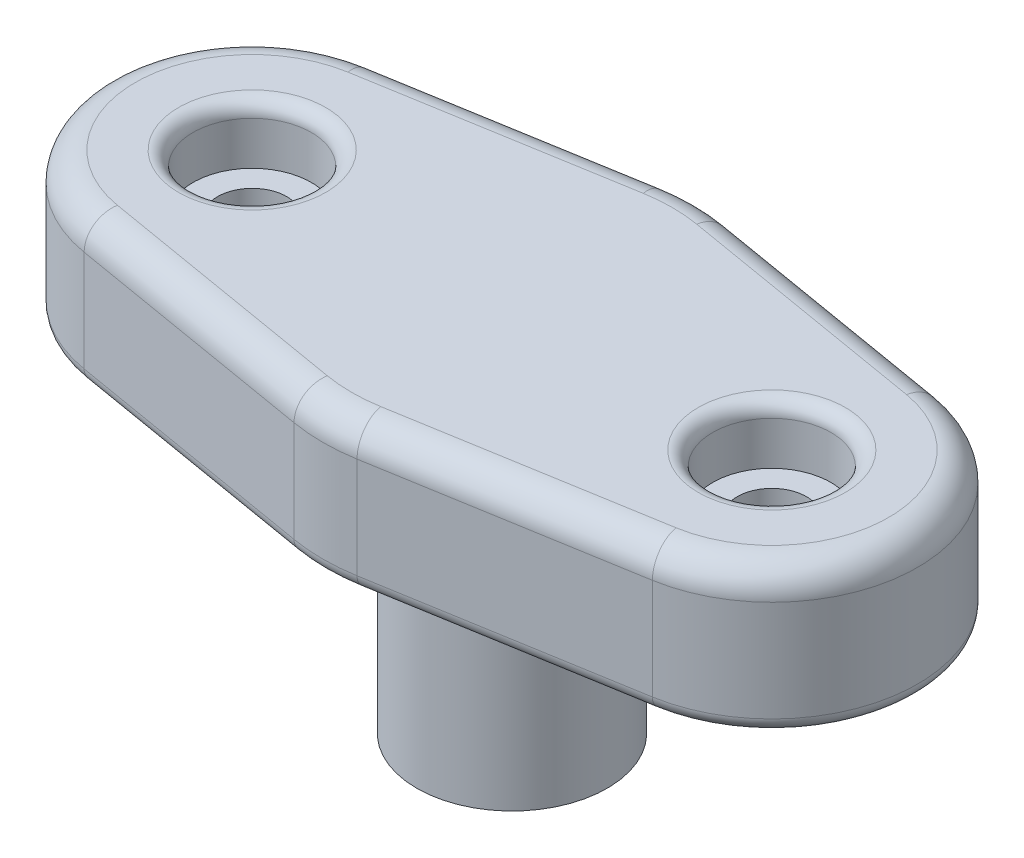
ISO-10303-21;
HEADER;
FILE_DESCRIPTION(('STEP AP214'),'2;1');
FILE_NAME('part.step','',(''),(''),'','','');
FILE_SCHEMA(('AUTOMOTIVE_DESIGN { 1 0 10303 214 1 1 1 1 }'));
ENDSEC;
DATA;
#1=APPLICATION_CONTEXT('core data for automotive mechanical design processes');
#2=APPLICATION_PROTOCOL_DEFINITION('international standard','automotive_design',2000,#1);
#3=PRODUCT_CONTEXT('',#1,'mechanical');
#4=PRODUCT('Part','Part','',(#3));
#5=PRODUCT_RELATED_PRODUCT_CATEGORY('part','',(#4));
#6=PRODUCT_DEFINITION_FORMATION('','',#4);
#7=PRODUCT_DEFINITION_CONTEXT('part definition',#1,'design');
#8=PRODUCT_DEFINITION('design','',#6,#7);
#9=PRODUCT_DEFINITION_SHAPE('','',#8);
#10=(LENGTH_UNIT() NAMED_UNIT(*) SI_UNIT(.MILLI.,.METRE.));
#11=(NAMED_UNIT(*) PLANE_ANGLE_UNIT() SI_UNIT($,.RADIAN.));
#12=(NAMED_UNIT(*) SI_UNIT($,.STERADIAN.) SOLID_ANGLE_UNIT());
#13=UNCERTAINTY_MEASURE_WITH_UNIT(LENGTH_MEASURE(1.E-05),#10,'distance_accuracy_value','');
#14=(GEOMETRIC_REPRESENTATION_CONTEXT(3) GLOBAL_UNCERTAINTY_ASSIGNED_CONTEXT((#13)) GLOBAL_UNIT_ASSIGNED_CONTEXT((#10,
#11,#12)) REPRESENTATION_CONTEXT('',''));
#15=CARTESIAN_POINT('',(0.,0.,0.));
#16=DIRECTION('',(0.,0.,1.));
#17=DIRECTION('',(1.,0.,0.));
#18=AXIS2_PLACEMENT_3D('',#15,#16,#17);
#19=CARTESIAN_POINT('',(9.,13.,0.));
#20=DIRECTION('',(0.,-1.,0.));
#21=DIRECTION('',(0.,0.,-1.));
#22=AXIS2_PLACEMENT_3D('',#19,#20,#21);
#23=CYLINDRICAL_SURFACE('',#22,1.2);
#24=CARTESIAN_POINT('',(9.,8.,0.));
#25=DIRECTION('',(0.,1.,0.));
#26=DIRECTION('',(0.,0.,1.));
#27=AXIS2_PLACEMENT_3D('',#24,#25,#26);
#28=CIRCLE('',#27,1.2);
#29=CARTESIAN_POINT('',(9.,8.,1.2));
#30=VERTEX_POINT('',#29);
#31=EDGE_CURVE('E414',#30,#30,#28,.T.);
#32=ORIENTED_EDGE('',*,*,#31,.F.);
#33=EDGE_LOOP('',(#32));
#34=FACE_BOUND('',#33,.T.);
#35=CARTESIAN_POINT('',(9.,11.,0.));
#36=DIRECTION('',(0.,1.,0.));
#37=DIRECTION('',(0.,0.,1.));
#38=AXIS2_PLACEMENT_3D('',#35,#36,#37);
#39=CIRCLE('',#38,1.2);
#40=CARTESIAN_POINT('',(9.,11.,1.2));
#41=VERTEX_POINT('',#40);
#42=EDGE_CURVE('E208',#41,#41,#39,.T.);
#43=ORIENTED_EDGE('',*,*,#42,.T.);
#44=EDGE_LOOP('',(#43));
#45=FACE_BOUND('',#44,.T.);
#46=ADVANCED_FACE('F45',(#34,#45),#23,.F.);
#47=CARTESIAN_POINT('',(-9.,13.,0.));
#48=DIRECTION('',(0.,-1.,0.));
#49=DIRECTION('',(0.,0.,-1.));
#50=AXIS2_PLACEMENT_3D('',#47,#48,#49);
#51=CYLINDRICAL_SURFACE('',#50,1.2);
#52=CARTESIAN_POINT('',(-9.,8.,0.));
#53=DIRECTION('',(0.,1.,0.));
#54=DIRECTION('',(0.,0.,1.));
#55=AXIS2_PLACEMENT_3D('',#52,#53,#54);
#56=CIRCLE('',#55,1.2);
#57=CARTESIAN_POINT('',(-9.,8.,1.2));
#58=VERTEX_POINT('',#57);
#59=EDGE_CURVE('E402',#58,#58,#56,.T.);
#60=ORIENTED_EDGE('',*,*,#59,.F.);
#61=EDGE_LOOP('',(#60));
#62=FACE_BOUND('',#61,.T.);
#63=CARTESIAN_POINT('',(-9.,11.,0.));
#64=DIRECTION('',(0.,1.,0.));
#65=DIRECTION('',(0.,0.,1.));
#66=AXIS2_PLACEMENT_3D('',#63,#64,#65);
#67=CIRCLE('',#66,1.2);
#68=CARTESIAN_POINT('',(-9.,11.,1.2));
#69=VERTEX_POINT('',#68);
#70=EDGE_CURVE('E393',#69,#69,#67,.T.);
#71=ORIENTED_EDGE('',*,*,#70,.T.);
#72=EDGE_LOOP('',(#71));
#73=FACE_BOUND('',#72,.T.);
#74=ADVANCED_FACE('F490',(#62,#73),#51,.F.);
#75=CARTESIAN_POINT('',(0.,8.,0.));
#76=DIRECTION('',(0.,-1.,0.));
#77=DIRECTION('',(0.,0.,-1.));
#78=AXIS2_PLACEMENT_3D('',#75,#76,#77);
#79=CYLINDRICAL_SURFACE('',#78,3.3);
#80=CARTESIAN_POINT('',(0.,8.,0.));
#81=DIRECTION('',(0.,1.,0.));
#82=DIRECTION('',(0.,0.,1.));
#83=AXIS2_PLACEMENT_3D('',#80,#81,#82);
#84=CIRCLE('',#83,3.3);
#85=CARTESIAN_POINT('',(0.,8.,3.3));
#86=VERTEX_POINT('',#85);
#87=EDGE_CURVE('E199',#86,#86,#84,.T.);
#88=ORIENTED_EDGE('',*,*,#87,.F.);
#89=EDGE_LOOP('',(#88));
#90=FACE_BOUND('',#89,.T.);
#91=CARTESIAN_POINT('',(0.,0.,0.));
#92=DIRECTION('',(0.,1.,0.));
#93=DIRECTION('',(0.,0.,1.));
#94=AXIS2_PLACEMENT_3D('',#91,#92,#93);
#95=CIRCLE('',#94,3.3);
#96=CARTESIAN_POINT('',(0.,0.,3.3));
#97=VERTEX_POINT('',#96);
#98=EDGE_CURVE('E168',#97,#97,#95,.T.);
#99=ORIENTED_EDGE('',*,*,#98,.T.);
#100=EDGE_LOOP('',(#99));
#101=FACE_BOUND('',#100,.T.);
#102=ADVANCED_FACE('F497',(#90,#101),#79,.T.);
#103=CARTESIAN_POINT('',(0.,0.,0.));
#104=DIRECTION('',(0.,1.,0.));
#105=DIRECTION('',(0.,0.,1.));
#106=AXIS2_PLACEMENT_3D('',#103,#104,#105);
#107=PLANE('',#106);
#108=ORIENTED_EDGE('',*,*,#98,.F.);
#109=EDGE_LOOP('',(#108));
#110=FACE_BOUND('',#109,.T.);
#111=ADVANCED_FACE('F507',(#110),#107,.F.);
#112=CARTESIAN_POINT('',(-9.,13.,0.));
#113=DIRECTION('',(0.,1.,0.));
#114=DIRECTION('',(0.,0.,1.));
#115=AXIS2_PLACEMENT_3D('',#112,#113,#114);
#116=PLANE('',#115);
#117=CARTESIAN_POINT('',(0.,13.,0.));
#118=DIRECTION('',(0.,1.,0.));
#119=DIRECTION('',(0.,0.,1.));
#120=AXIS2_PLACEMENT_3D('',#117,#118,#119);
#121=CIRCLE('',#120,5.55);
#122=CARTESIAN_POINT('',(0.925000000000002,13.,-5.47237379936714));
#123=VERTEX_POINT('',#122);
#124=CARTESIAN_POINT('',(-0.924999999999999,13.,-5.47237379936714));
#125=VERTEX_POINT('',#124);
#126=EDGE_CURVE('E310',#123,#125,#121,.T.);
#127=ORIENTED_EDGE('',*,*,#126,.T.);
#128=DIRECTION('',(-0.986013297183269,0.,0.166666666666667));
#129=VECTOR('',#128,1.);
#130=CARTESIAN_POINT('',(-9.675,13.,-3.99335385359224));
#131=LINE('',#130,#129);
#132=CARTESIAN_POINT('',(-9.675,13.,-3.99335385359224));
#133=VERTEX_POINT('',#132);
#134=EDGE_CURVE('E313',#125,#133,#131,.T.);
#135=ORIENTED_EDGE('',*,*,#134,.T.);
#136=CARTESIAN_POINT('',(-9.,13.,0.));
#137=DIRECTION('',(0.,1.,0.));
#138=DIRECTION('',(0.,0.,1.));
#139=AXIS2_PLACEMENT_3D('',#136,#137,#138);
#140=CIRCLE('',#139,4.05);
#141=CARTESIAN_POINT('',(-9.675,13.,3.99335385359224));
#142=VERTEX_POINT('',#141);
#143=EDGE_CURVE('E266',#133,#142,#140,.T.);
#144=ORIENTED_EDGE('',*,*,#143,.T.);
#145=DIRECTION('',(0.986013297183269,0.,0.166666666666666));
#146=VECTOR('',#145,1.);
#147=CARTESIAN_POINT('',(-0.925,13.,5.47237379936715));
#148=LINE('',#147,#146);
#149=CARTESIAN_POINT('',(-0.925,13.,5.47237379936715));
#150=VERTEX_POINT('',#149);
#151=EDGE_CURVE('E295',#142,#150,#148,.T.);
#152=ORIENTED_EDGE('',*,*,#151,.T.);
#153=CARTESIAN_POINT('',(0.,13.,0.));
#154=DIRECTION('',(0.,1.,0.));
#155=DIRECTION('',(0.,0.,1.));
#156=AXIS2_PLACEMENT_3D('',#153,#154,#155);
#157=CIRCLE('',#156,5.55);
#158=CARTESIAN_POINT('',(0.925000000000002,13.,5.47237379936714));
#159=VERTEX_POINT('',#158);
#160=EDGE_CURVE('E298',#150,#159,#157,.T.);
#161=ORIENTED_EDGE('',*,*,#160,.T.);
#162=DIRECTION('',(0.986013297183269,0.,-0.166666666666667));
#163=VECTOR('',#162,1.);
#164=CARTESIAN_POINT('',(9.675,13.,3.99335385359224));
#165=LINE('',#164,#163);
#166=CARTESIAN_POINT('',(9.675,13.,3.99335385359224));
#167=VERTEX_POINT('',#166);
#168=EDGE_CURVE('E301',#159,#167,#165,.T.);
#169=ORIENTED_EDGE('',*,*,#168,.T.);
#170=CARTESIAN_POINT('',(9.,13.,0.));
#171=DIRECTION('',(0.,1.,0.));
#172=DIRECTION('',(0.,0.,1.));
#173=AXIS2_PLACEMENT_3D('',#170,#171,#172);
#174=CIRCLE('',#173,4.05);
#175=CARTESIAN_POINT('',(9.675,13.,-3.99335385359224));
#176=VERTEX_POINT('',#175);
#177=EDGE_CURVE('E304',#167,#176,#174,.T.);
#178=ORIENTED_EDGE('',*,*,#177,.T.);
#179=DIRECTION('',(-0.986013297183269,0.,-0.166666666666667));
#180=VECTOR('',#179,1.);
#181=CARTESIAN_POINT('',(0.925000000000004,13.,-5.47237379936714));
#182=LINE('',#181,#180);
#183=EDGE_CURVE('E307',#176,#123,#182,.T.);
#184=ORIENTED_EDGE('',*,*,#183,.T.);
#185=EDGE_LOOP('',(#127,#135,#144,#152,#161,#169,#178,#184));
#186=FACE_BOUND('',#185,.T.);
#187=CARTESIAN_POINT('',(9.,13.,0.));
#188=DIRECTION('',(0.,1.,0.));
#189=DIRECTION('',(0.,0.,1.));
#190=AXIS2_PLACEMENT_3D('',#187,#188,#189);
#191=CIRCLE('',#190,2.55);
#192=CARTESIAN_POINT('',(9.,13.,2.55));
#193=VERTEX_POINT('',#192);
#194=EDGE_CURVE('E259',#193,#193,#191,.F.);
#195=ORIENTED_EDGE('',*,*,#194,.T.);
#196=EDGE_LOOP('',(#195));
#197=FACE_BOUND('',#196,.T.);
#198=CARTESIAN_POINT('',(-9.,13.,0.));
#199=DIRECTION('',(0.,1.,0.));
#200=DIRECTION('',(0.,0.,1.));
#201=AXIS2_PLACEMENT_3D('',#198,#199,#200);
#202=CIRCLE('',#201,2.55);
#203=CARTESIAN_POINT('',(-9.,13.,2.55));
#204=VERTEX_POINT('',#203);
#205=EDGE_CURVE('E255',#204,#204,#202,.F.);
#206=ORIENTED_EDGE('',*,*,#205,.T.);
#207=EDGE_LOOP('',(#206));
#208=FACE_BOUND('',#207,.T.);
#209=ADVANCED_FACE('F464',(#186,#197,#208),#116,.T.);
#210=CARTESIAN_POINT('',(-9.,8.,0.));
#211=DIRECTION('',(0.,1.,0.));
#212=DIRECTION('',(0.,0.,1.));
#213=AXIS2_PLACEMENT_3D('',#210,#211,#212);
#214=PLANE('',#213);
#215=DIRECTION('',(0.986013297183269,0.,0.166666666666666));
#216=VECTOR('',#215,1.);
#217=CARTESIAN_POINT('',(-9.75833333333333,8.,4.48636050218388));
#218=LINE('',#217,#216);
#219=CARTESIAN_POINT('',(-1.00833333333333,8.,5.96538044795878));
#220=VERTEX_POINT('',#219);
#221=CARTESIAN_POINT('',(-9.75833333333333,8.,4.48636050218388));
#222=VERTEX_POINT('',#221);
#223=EDGE_CURVE('E198',#220,#222,#218,.F.);
#224=ORIENTED_EDGE('',*,*,#223,.T.);
#225=CARTESIAN_POINT('',(-9.,8.,0.));
#226=DIRECTION('',(0.,1.,0.));
#227=DIRECTION('',(0.,0.,1.));
#228=AXIS2_PLACEMENT_3D('',#225,#226,#227);
#229=CIRCLE('',#228,4.55);
#230=CARTESIAN_POINT('',(-9.75833333333333,8.,-4.48636050218387));
#231=VERTEX_POINT('',#230);
#232=EDGE_CURVE('E179',#222,#231,#229,.F.);
#233=ORIENTED_EDGE('',*,*,#232,.T.);
#234=DIRECTION('',(-0.986013297183269,0.,0.166666666666667));
#235=VECTOR('',#234,1.);
#236=CARTESIAN_POINT('',(-9.75833333333333,8.,-4.48636050218387));
#237=LINE('',#236,#235);
#238=CARTESIAN_POINT('',(-1.00833333333333,8.,-5.96538044795878));
#239=VERTEX_POINT('',#238);
#240=EDGE_CURVE('E225',#231,#239,#237,.F.);
#241=ORIENTED_EDGE('',*,*,#240,.T.);
#242=CARTESIAN_POINT('',(0.,8.,0.));
#243=DIRECTION('',(0.,1.,0.));
#244=DIRECTION('',(0.,0.,1.));
#245=AXIS2_PLACEMENT_3D('',#242,#243,#244);
#246=CIRCLE('',#245,6.05);
#247=CARTESIAN_POINT('',(1.00833333333334,8.,-5.96538044795878));
#248=VERTEX_POINT('',#247);
#249=EDGE_CURVE('E222',#239,#248,#246,.F.);
#250=ORIENTED_EDGE('',*,*,#249,.T.);
#251=DIRECTION('',(-0.986013297183269,0.,-0.166666666666667));
#252=VECTOR('',#251,1.);
#253=CARTESIAN_POINT('',(-7.74166666666666,8.,-7.44440039373368));
#254=LINE('',#253,#252);
#255=CARTESIAN_POINT('',(9.75833333333334,8.,-4.48636050218387));
#256=VERTEX_POINT('',#255);
#257=EDGE_CURVE('E219',#248,#256,#254,.F.);
#258=ORIENTED_EDGE('',*,*,#257,.T.);
#259=CARTESIAN_POINT('',(9.,8.,0.));
#260=DIRECTION('',(0.,1.,0.));
#261=DIRECTION('',(0.,0.,1.));
#262=AXIS2_PLACEMENT_3D('',#259,#260,#261);
#263=CIRCLE('',#262,4.55);
#264=CARTESIAN_POINT('',(9.75833333333333,8.,4.48636050218387));
#265=VERTEX_POINT('',#264);
#266=EDGE_CURVE('E216',#256,#265,#263,.F.);
#267=ORIENTED_EDGE('',*,*,#266,.T.);
#268=DIRECTION('',(0.986013297183269,0.,-0.166666666666667));
#269=VECTOR('',#268,1.);
#270=CARTESIAN_POINT('',(-7.74166666666666,8.,7.44440039373368));
#271=LINE('',#270,#269);
#272=CARTESIAN_POINT('',(1.00833333333334,8.,5.96538044795878));
#273=VERTEX_POINT('',#272);
#274=EDGE_CURVE('E213',#265,#273,#271,.F.);
#275=ORIENTED_EDGE('',*,*,#274,.T.);
#276=CARTESIAN_POINT('',(0.,8.,0.));
#277=DIRECTION('',(0.,1.,0.));
#278=DIRECTION('',(0.,0.,1.));
#279=AXIS2_PLACEMENT_3D('',#276,#277,#278);
#280=CIRCLE('',#279,6.05);
#281=EDGE_CURVE('E203',#273,#220,#280,.F.);
#282=ORIENTED_EDGE('',*,*,#281,.T.);
#283=EDGE_LOOP('',(#224,#233,#241,#250,#258,#267,#275,#282));
#284=FACE_BOUND('',#283,.T.);
#285=ORIENTED_EDGE('',*,*,#87,.T.);
#286=EDGE_LOOP('',(#285));
#287=FACE_BOUND('',#286,.T.);
#288=ORIENTED_EDGE('',*,*,#31,.T.);
#289=EDGE_LOOP('',(#288));
#290=FACE_BOUND('',#289,.T.);
#291=ORIENTED_EDGE('',*,*,#59,.T.);
#292=EDGE_LOOP('',(#291));
#293=FACE_BOUND('',#292,.T.);
#294=ADVANCED_FACE('F506',(#284,#287,#290,#293),#214,.F.);
#295=CARTESIAN_POINT('',(-9.,13.,0.));
#296=DIRECTION('',(0.,-1.,0.));
#297=DIRECTION('',(0.,0.,-1.));
#298=AXIS2_PLACEMENT_3D('',#295,#296,#297);
#299=CYLINDRICAL_SURFACE('',#298,5.05);
#300=DIRECTION('',(0.,-1.,0.));
#301=VECTOR('',#300,1.);
#302=CARTESIAN_POINT('',(-9.84166666666667,13.,4.97936715077551));
#303=LINE('',#302,#301);
#304=CARTESIAN_POINT('',(-9.84166666666667,12.,4.97936715077551));
#305=VERTEX_POINT('',#304);
#306=CARTESIAN_POINT('',(-9.84166666666667,8.5,4.97936715077551));
#307=VERTEX_POINT('',#306);
#308=EDGE_CURVE('E158',#305,#307,#303,.T.);
#309=ORIENTED_EDGE('',*,*,#308,.F.);
#310=CARTESIAN_POINT('',(-9.,12.,0.));
#311=DIRECTION('',(0.,1.,0.));
#312=DIRECTION('',(0.,0.,1.));
#313=AXIS2_PLACEMENT_3D('',#310,#311,#312);
#314=CIRCLE('',#313,5.05);
#315=CARTESIAN_POINT('',(-9.84166666666667,12.,-4.97936715077551));
#316=VERTEX_POINT('',#315);
#317=EDGE_CURVE('E11',#305,#316,#314,.F.);
#318=ORIENTED_EDGE('',*,*,#317,.T.);
#319=DIRECTION('',(0.,-1.,0.));
#320=VECTOR('',#319,1.);
#321=CARTESIAN_POINT('',(-9.84166666666667,13.,-4.97936715077551));
#322=LINE('',#321,#320);
#323=CARTESIAN_POINT('',(-9.84166666666667,8.5,-4.97936715077551));
#324=VERTEX_POINT('',#323);
#325=EDGE_CURVE('E195',#316,#324,#322,.T.);
#326=ORIENTED_EDGE('',*,*,#325,.T.);
#327=CARTESIAN_POINT('',(-9.,8.5,0.));
#328=DIRECTION('',(0.,1.,0.));
#329=DIRECTION('',(0.,0.,1.));
#330=AXIS2_PLACEMENT_3D('',#327,#328,#329);
#331=CIRCLE('',#330,5.05);
#332=EDGE_CURVE('E177',#324,#307,#331,.T.);
#333=ORIENTED_EDGE('',*,*,#332,.T.);
#334=EDGE_LOOP('',(#309,#318,#326,#333));
#335=FACE_BOUND('',#334,.T.);
#336=ADVANCED_FACE('F193',(#335),#299,.T.);
#337=CARTESIAN_POINT('',(-1.09166666666667,13.,6.45838709655041));
#338=DIRECTION('',(0.166666666666666,0.,-0.986013297183269));
#339=DIRECTION('',(-0.986013297183269,0.,-0.166666666666666));
#340=AXIS2_PLACEMENT_3D('',#337,#338,#339);
#341=PLANE('',#340);
#342=DIRECTION('',(0.,-1.,0.));
#343=VECTOR('',#342,1.);
#344=CARTESIAN_POINT('',(-1.09166666666667,13.,6.45838709655041));
#345=LINE('',#344,#343);
#346=CARTESIAN_POINT('',(-1.09166666666667,12.,6.45838709655041));
#347=VERTEX_POINT('',#346);
#348=CARTESIAN_POINT('',(-1.09166666666667,8.5,6.45838709655041));
#349=VERTEX_POINT('',#348);
#350=EDGE_CURVE('E169',#347,#349,#345,.T.);
#351=ORIENTED_EDGE('',*,*,#350,.F.);
#352=DIRECTION('',(0.986013297183269,0.,0.166666666666666));
#353=VECTOR('',#352,1.);
#354=CARTESIAN_POINT('',(-9.84166666666667,12.,4.97936715077551));
#355=LINE('',#354,#353);
#356=EDGE_CURVE('E55',#347,#305,#355,.F.);
#357=ORIENTED_EDGE('',*,*,#356,.T.);
#358=ORIENTED_EDGE('',*,*,#308,.T.);
#359=DIRECTION('',(0.986013297183269,0.,0.166666666666666));
#360=VECTOR('',#359,1.);
#361=CARTESIAN_POINT('',(-1.09166666666667,8.5,6.45838709655041));
#362=LINE('',#361,#360);
#363=EDGE_CURVE('E162',#307,#349,#362,.T.);
#364=ORIENTED_EDGE('',*,*,#363,.T.);
#365=EDGE_LOOP('',(#351,#357,#358,#364));
#366=FACE_BOUND('',#365,.T.);
#367=ADVANCED_FACE('F160',(#366),#341,.F.);
#368=CARTESIAN_POINT('',(0.,13.,0.));
#369=DIRECTION('',(0.,-1.,0.));
#370=DIRECTION('',(0.,0.,-1.));
#371=AXIS2_PLACEMENT_3D('',#368,#369,#370);
#372=CYLINDRICAL_SURFACE('',#371,6.55);
#373=DIRECTION('',(0.,-1.,0.));
#374=VECTOR('',#373,1.);
#375=CARTESIAN_POINT('',(1.09166666666667,13.,6.45838709655041));
#376=LINE('',#375,#374);
#377=CARTESIAN_POINT('',(1.09166666666667,12.,6.45838709655041));
#378=VERTEX_POINT('',#377);
#379=CARTESIAN_POINT('',(1.09166666666667,8.5,6.45838709655041));
#380=VERTEX_POINT('',#379);
#381=EDGE_CURVE('E378',#378,#380,#376,.T.);
#382=ORIENTED_EDGE('',*,*,#381,.F.);
#383=CARTESIAN_POINT('',(0.,12.,0.));
#384=DIRECTION('',(0.,1.,0.));
#385=DIRECTION('',(0.,0.,1.));
#386=AXIS2_PLACEMENT_3D('',#383,#384,#385);
#387=CIRCLE('',#386,6.55);
#388=EDGE_CURVE('E70',#378,#347,#387,.F.);
#389=ORIENTED_EDGE('',*,*,#388,.T.);
#390=ORIENTED_EDGE('',*,*,#350,.T.);
#391=CARTESIAN_POINT('',(0.,8.5,0.));
#392=DIRECTION('',(0.,1.,0.));
#393=DIRECTION('',(0.,0.,1.));
#394=AXIS2_PLACEMENT_3D('',#391,#392,#393);
#395=CIRCLE('',#394,6.55);
#396=EDGE_CURVE('E191',#349,#380,#395,.T.);
#397=ORIENTED_EDGE('',*,*,#396,.T.);
#398=EDGE_LOOP('',(#382,#389,#390,#397));
#399=FACE_BOUND('',#398,.T.);
#400=ADVANCED_FACE('F380',(#399),#372,.T.);
#401=CARTESIAN_POINT('',(9.84166666666667,13.,4.97936715077551));
#402=DIRECTION('',(-0.166666666666667,0.,-0.986013297183269));
#403=DIRECTION('',(-0.986013297183269,0.,0.166666666666667));
#404=AXIS2_PLACEMENT_3D('',#401,#402,#403);
#405=PLANE('',#404);
#406=DIRECTION('',(0.,-1.,0.));
#407=VECTOR('',#406,1.);
#408=CARTESIAN_POINT('',(9.84166666666667,13.,4.97936715077551));
#409=LINE('',#408,#407);
#410=CARTESIAN_POINT('',(9.84166666666667,12.,4.97936715077551));
#411=VERTEX_POINT('',#410);
#412=CARTESIAN_POINT('',(9.84166666666667,8.5,4.97936715077551));
#413=VERTEX_POINT('',#412);
#414=EDGE_CURVE('E379',#411,#413,#409,.T.);
#415=ORIENTED_EDGE('',*,*,#414,.F.);
#416=DIRECTION('',(0.986013297183269,0.,-0.166666666666667));
#417=VECTOR('',#416,1.);
#418=CARTESIAN_POINT('',(1.09166666666667,12.,6.45838709655041));
#419=LINE('',#418,#417);
#420=EDGE_CURVE('E330',#411,#378,#419,.F.);
#421=ORIENTED_EDGE('',*,*,#420,.T.);
#422=ORIENTED_EDGE('',*,*,#381,.T.);
#423=DIRECTION('',(0.986013297183269,0.,-0.166666666666667));
#424=VECTOR('',#423,1.);
#425=CARTESIAN_POINT('',(9.84166666666667,8.5,4.97936715077551));
#426=LINE('',#425,#424);
#427=EDGE_CURVE('E245',#380,#413,#426,.T.);
#428=ORIENTED_EDGE('',*,*,#427,.T.);
#429=EDGE_LOOP('',(#415,#421,#422,#428));
#430=FACE_BOUND('',#429,.T.);
#431=ADVANCED_FACE('F377',(#430),#405,.F.);
#432=CARTESIAN_POINT('',(9.,13.,0.));
#433=DIRECTION('',(0.,-1.,0.));
#434=DIRECTION('',(0.,0.,-1.));
#435=AXIS2_PLACEMENT_3D('',#432,#433,#434);
#436=CYLINDRICAL_SURFACE('',#435,5.05);
#437=DIRECTION('',(0.,-1.,0.));
#438=VECTOR('',#437,1.);
#439=CARTESIAN_POINT('',(9.84166666666667,13.,-4.9793671507755));
#440=LINE('',#439,#438);
#441=CARTESIAN_POINT('',(9.84166666666667,12.,-4.9793671507755));
#442=VERTEX_POINT('',#441);
#443=CARTESIAN_POINT('',(9.84166666666667,8.5,-4.9793671507755));
#444=VERTEX_POINT('',#443);
#445=EDGE_CURVE('E387',#442,#444,#440,.T.);
#446=ORIENTED_EDGE('',*,*,#445,.F.);
#447=CARTESIAN_POINT('',(9.,12.,0.));
#448=DIRECTION('',(0.,1.,0.));
#449=DIRECTION('',(0.,0.,1.));
#450=AXIS2_PLACEMENT_3D('',#447,#448,#449);
#451=CIRCLE('',#450,5.05);
#452=EDGE_CURVE('E327',#442,#411,#451,.F.);
#453=ORIENTED_EDGE('',*,*,#452,.T.);
#454=ORIENTED_EDGE('',*,*,#414,.T.);
#455=CARTESIAN_POINT('',(9.,8.5,0.));
#456=DIRECTION('',(0.,1.,0.));
#457=DIRECTION('',(0.,0.,1.));
#458=AXIS2_PLACEMENT_3D('',#455,#456,#457);
#459=CIRCLE('',#458,5.05);
#460=EDGE_CURVE('E241',#413,#444,#459,.T.);
#461=ORIENTED_EDGE('',*,*,#460,.T.);
#462=EDGE_LOOP('',(#446,#453,#454,#461));
#463=FACE_BOUND('',#462,.T.);
#464=ADVANCED_FACE('F436',(#463),#436,.T.);
#465=CARTESIAN_POINT('',(1.09166666666667,13.,-6.45838709655041));
#466=DIRECTION('',(-0.166666666666667,0.,0.986013297183269));
#467=DIRECTION('',(0.986013297183269,0.,0.166666666666667));
#468=AXIS2_PLACEMENT_3D('',#465,#466,#467);
#469=PLANE('',#468);
#470=DIRECTION('',(0.,-1.,0.));
#471=VECTOR('',#470,1.);
#472=CARTESIAN_POINT('',(1.09166666666667,13.,-6.45838709655041));
#473=LINE('',#472,#471);
#474=CARTESIAN_POINT('',(1.09166666666667,12.,-6.45838709655041));
#475=VERTEX_POINT('',#474);
#476=CARTESIAN_POINT('',(1.09166666666667,8.5,-6.45838709655041));
#477=VERTEX_POINT('',#476);
#478=EDGE_CURVE('E423',#475,#477,#473,.T.);
#479=ORIENTED_EDGE('',*,*,#478,.F.);
#480=DIRECTION('',(-0.986013297183269,0.,-0.166666666666667));
#481=VECTOR('',#480,1.);
#482=CARTESIAN_POINT('',(9.84166666666667,12.,-4.9793671507755));
#483=LINE('',#482,#481);
#484=EDGE_CURVE('E324',#475,#442,#483,.F.);
#485=ORIENTED_EDGE('',*,*,#484,.T.);
#486=ORIENTED_EDGE('',*,*,#445,.T.);
#487=DIRECTION('',(-0.986013297183269,0.,-0.166666666666667));
#488=VECTOR('',#487,1.);
#489=CARTESIAN_POINT('',(1.09166666666667,8.5,-6.45838709655041));
#490=LINE('',#489,#488);
#491=EDGE_CURVE('E237',#444,#477,#490,.T.);
#492=ORIENTED_EDGE('',*,*,#491,.T.);
#493=EDGE_LOOP('',(#479,#485,#486,#492));
#494=FACE_BOUND('',#493,.T.);
#495=ADVANCED_FACE('F429',(#494),#469,.F.);
#496=CARTESIAN_POINT('',(0.,13.,0.));
#497=DIRECTION('',(0.,-1.,0.));
#498=DIRECTION('',(0.,0.,-1.));
#499=AXIS2_PLACEMENT_3D('',#496,#497,#498);
#500=CYLINDRICAL_SURFACE('',#499,6.55);
#501=DIRECTION('',(0.,-1.,0.));
#502=VECTOR('',#501,1.);
#503=CARTESIAN_POINT('',(-1.09166666666667,13.,-6.45838709655041));
#504=LINE('',#503,#502);
#505=CARTESIAN_POINT('',(-1.09166666666667,12.,-6.45838709655041));
#506=VERTEX_POINT('',#505);
#507=CARTESIAN_POINT('',(-1.09166666666667,8.5,-6.45838709655041));
#508=VERTEX_POINT('',#507);
#509=EDGE_CURVE('E420',#506,#508,#504,.T.);
#510=ORIENTED_EDGE('',*,*,#509,.F.);
#511=CARTESIAN_POINT('',(0.,12.,0.));
#512=DIRECTION('',(0.,1.,0.));
#513=DIRECTION('',(0.,0.,1.));
#514=AXIS2_PLACEMENT_3D('',#511,#512,#513);
#515=CIRCLE('',#514,6.55);
#516=EDGE_CURVE('E321',#506,#475,#515,.F.);
#517=ORIENTED_EDGE('',*,*,#516,.T.);
#518=ORIENTED_EDGE('',*,*,#478,.T.);
#519=CARTESIAN_POINT('',(0.,8.5,0.));
#520=DIRECTION('',(0.,1.,0.));
#521=DIRECTION('',(0.,0.,1.));
#522=AXIS2_PLACEMENT_3D('',#519,#520,#521);
#523=CIRCLE('',#522,6.55);
#524=EDGE_CURVE('E233',#477,#508,#523,.T.);
#525=ORIENTED_EDGE('',*,*,#524,.T.);
#526=EDGE_LOOP('',(#510,#517,#518,#525));
#527=FACE_BOUND('',#526,.T.);
#528=ADVANCED_FACE('F452',(#527),#500,.T.);
#529=CARTESIAN_POINT('',(-9.84166666666667,13.,-4.97936715077551));
#530=DIRECTION('',(0.166666666666667,0.,0.986013297183269));
#531=DIRECTION('',(0.986013297183269,0.,-0.166666666666667));
#532=AXIS2_PLACEMENT_3D('',#529,#530,#531);
#533=PLANE('',#532);
#534=ORIENTED_EDGE('',*,*,#325,.F.);
#535=DIRECTION('',(-0.986013297183269,0.,0.166666666666667));
#536=VECTOR('',#535,1.);
#537=CARTESIAN_POINT('',(-1.09166666666667,12.,-6.45838709655041));
#538=LINE('',#537,#536);
#539=EDGE_CURVE('E317',#316,#506,#538,.F.);
#540=ORIENTED_EDGE('',*,*,#539,.T.);
#541=ORIENTED_EDGE('',*,*,#509,.T.);
#542=DIRECTION('',(-0.986013297183269,0.,0.166666666666667));
#543=VECTOR('',#542,1.);
#544=CARTESIAN_POINT('',(-9.84166666666667,8.5,-4.97936715077551));
#545=LINE('',#544,#543);
#546=EDGE_CURVE('E230',#508,#324,#545,.T.);
#547=ORIENTED_EDGE('',*,*,#546,.T.);
#548=EDGE_LOOP('',(#534,#540,#541,#547));
#549=FACE_BOUND('',#548,.T.);
#550=ADVANCED_FACE('F478',(#549),#533,.F.);
#551=CARTESIAN_POINT('',(-9.,11.,0.));
#552=DIRECTION('',(0.,1.,0.));
#553=DIRECTION('',(0.,0.,1.));
#554=AXIS2_PLACEMENT_3D('',#551,#552,#553);
#555=CYLINDRICAL_SURFACE('',#554,2.05);
#556=CARTESIAN_POINT('',(-9.,12.5,0.));
#557=DIRECTION('',(0.,1.,0.));
#558=DIRECTION('',(0.,0.,1.));
#559=AXIS2_PLACEMENT_3D('',#556,#557,#558);
#560=CIRCLE('',#559,2.05);
#561=CARTESIAN_POINT('',(-9.,12.5,2.05));
#562=VERTEX_POINT('',#561);
#563=EDGE_CURVE('E263',#562,#562,#560,.T.);
#564=ORIENTED_EDGE('',*,*,#563,.T.);
#565=EDGE_LOOP('',(#564));
#566=FACE_BOUND('',#565,.T.);
#567=CARTESIAN_POINT('',(-9.,11.,0.));
#568=DIRECTION('',(0.,1.,0.));
#569=DIRECTION('',(0.,0.,1.));
#570=AXIS2_PLACEMENT_3D('',#567,#568,#569);
#571=CIRCLE('',#570,2.05);
#572=CARTESIAN_POINT('',(-9.,11.,2.05));
#573=VERTEX_POINT('',#572);
#574=EDGE_CURVE('E396',#573,#573,#571,.T.);
#575=ORIENTED_EDGE('',*,*,#574,.F.);
#576=EDGE_LOOP('',(#575));
#577=FACE_BOUND('',#576,.T.);
#578=ADVANCED_FACE('F513',(#566,#577),#555,.F.);
#579=CARTESIAN_POINT('',(-9.,11.,0.));
#580=DIRECTION('',(0.,1.,0.));
#581=DIRECTION('',(0.,0.,1.));
#582=AXIS2_PLACEMENT_3D('',#579,#580,#581);
#583=PLANE('',#582);
#584=ORIENTED_EDGE('',*,*,#70,.F.);
#585=EDGE_LOOP('',(#584));
#586=FACE_BOUND('',#585,.T.);
#587=ORIENTED_EDGE('',*,*,#574,.T.);
#588=EDGE_LOOP('',(#587));
#589=FACE_BOUND('',#588,.T.);
#590=ADVANCED_FACE('F571',(#586,#589),#583,.T.);
#591=CARTESIAN_POINT('',(9.,11.,0.));
#592=DIRECTION('',(0.,1.,0.));
#593=DIRECTION('',(0.,0.,1.));
#594=AXIS2_PLACEMENT_3D('',#591,#592,#593);
#595=CYLINDRICAL_SURFACE('',#594,2.05);
#596=CARTESIAN_POINT('',(9.,12.5,0.));
#597=DIRECTION('',(0.,1.,0.));
#598=DIRECTION('',(0.,0.,1.));
#599=AXIS2_PLACEMENT_3D('',#596,#597,#598);
#600=CIRCLE('',#599,2.05);
#601=CARTESIAN_POINT('',(9.,12.5,2.05));
#602=VERTEX_POINT('',#601);
#603=EDGE_CURVE('E190',#602,#602,#600,.T.);
#604=ORIENTED_EDGE('',*,*,#603,.T.);
#605=EDGE_LOOP('',(#604));
#606=FACE_BOUND('',#605,.T.);
#607=CARTESIAN_POINT('',(9.,11.,0.));
#608=DIRECTION('',(0.,1.,0.));
#609=DIRECTION('',(0.,0.,1.));
#610=AXIS2_PLACEMENT_3D('',#607,#608,#609);
#611=CIRCLE('',#610,2.05);
#612=CARTESIAN_POINT('',(9.,11.,2.05));
#613=VERTEX_POINT('',#612);
#614=EDGE_CURVE('E292',#613,#613,#611,.T.);
#615=ORIENTED_EDGE('',*,*,#614,.F.);
#616=EDGE_LOOP('',(#615));
#617=FACE_BOUND('',#616,.T.);
#618=ADVANCED_FACE('F577',(#606,#617),#595,.F.);
#619=CARTESIAN_POINT('',(9.,11.,0.));
#620=DIRECTION('',(0.,1.,0.));
#621=DIRECTION('',(0.,0.,1.));
#622=AXIS2_PLACEMENT_3D('',#619,#620,#621);
#623=PLANE('',#622);
#624=ORIENTED_EDGE('',*,*,#42,.F.);
#625=EDGE_LOOP('',(#624));
#626=FACE_BOUND('',#625,.T.);
#627=ORIENTED_EDGE('',*,*,#614,.T.);
#628=EDGE_LOOP('',(#627));
#629=FACE_BOUND('',#628,.T.);
#630=ADVANCED_FACE('F556',(#626,#629),#623,.T.);
#631=CARTESIAN_POINT('',(9.,8.5,0.));
#632=DIRECTION('',(0.,1.,0.));
#633=DIRECTION('',(0.,0.,1.));
#634=AXIS2_PLACEMENT_3D('',#631,#632,#633);
#635=TOROIDAL_SURFACE('',#634,4.55,0.5);
#636=CARTESIAN_POINT('',(9.75833333333333,8.5,4.48636050218387));
#637=DIRECTION('',(-0.98601329718327,0.,0.166666666666665));
#638=DIRECTION('',(0.166666666666665,0.,0.98601329718327));
#639=AXIS2_PLACEMENT_3D('',#636,#637,#638);
#640=CIRCLE('',#639,0.5);
#641=EDGE_CURVE('E284',#265,#413,#640,.T.);
#642=ORIENTED_EDGE('',*,*,#641,.F.);
#643=ORIENTED_EDGE('',*,*,#266,.F.);
#644=CARTESIAN_POINT('',(9.75833333333334,8.5,-4.48636050218387));
#645=DIRECTION('',(-0.986013297183269,0.,-0.166666666666666));
#646=DIRECTION('',(-0.166666666666666,0.,0.98601329718327));
#647=AXIS2_PLACEMENT_3D('',#644,#645,#646);
#648=CIRCLE('',#647,0.5);
#649=EDGE_CURVE('E288',#444,#256,#648,.T.);
#650=ORIENTED_EDGE('',*,*,#649,.F.);
#651=ORIENTED_EDGE('',*,*,#460,.F.);
#652=EDGE_LOOP('',(#642,#643,#650,#651));
#653=FACE_BOUND('',#652,.T.);
#654=ADVANCED_FACE('F440',(#653),#635,.T.);
#655=CARTESIAN_POINT('',(1.00833333333334,8.5,-5.96538044795878));
#656=DIRECTION('',(-0.986013297183269,0.,-0.166666666666667));
#657=DIRECTION('',(-0.166666666666667,0.,0.986013297183269));
#658=AXIS2_PLACEMENT_3D('',#655,#656,#657);
#659=CYLINDRICAL_SURFACE('',#658,0.5);
#660=ORIENTED_EDGE('',*,*,#649,.T.);
#661=ORIENTED_EDGE('',*,*,#257,.F.);
#662=CARTESIAN_POINT('',(1.00833333333334,8.5,-5.96538044795878));
#663=DIRECTION('',(-0.986013297183269,0.,-0.166666666666667));
#664=DIRECTION('',(-0.166666666666667,0.,0.986013297183269));
#665=AXIS2_PLACEMENT_3D('',#662,#663,#664);
#666=CIRCLE('',#665,0.5);
#667=EDGE_CURVE('E280',#477,#248,#666,.T.);
#668=ORIENTED_EDGE('',*,*,#667,.F.);
#669=ORIENTED_EDGE('',*,*,#491,.F.);
#670=EDGE_LOOP('',(#660,#661,#668,#669));
#671=FACE_BOUND('',#670,.T.);
#672=ADVANCED_FACE('F443',(#671),#659,.T.);
#673=CARTESIAN_POINT('',(9.75833333333333,8.5,4.48636050218387));
#674=DIRECTION('',(0.986013297183269,0.,-0.166666666666667));
#675=DIRECTION('',(-0.166666666666667,0.,-0.986013297183269));
#676=AXIS2_PLACEMENT_3D('',#673,#674,#675);
#677=CYLINDRICAL_SURFACE('',#676,0.5);
#678=ORIENTED_EDGE('',*,*,#641,.T.);
#679=ORIENTED_EDGE('',*,*,#427,.F.);
#680=CARTESIAN_POINT('',(1.00833333333334,8.5,5.96538044795878));
#681=DIRECTION('',(-0.986013297183269,0.,0.166666666666667));
#682=DIRECTION('',(0.166666666666667,0.,0.986013297183269));
#683=AXIS2_PLACEMENT_3D('',#680,#681,#682);
#684=CIRCLE('',#683,0.5);
#685=EDGE_CURVE('E276',#273,#380,#684,.T.);
#686=ORIENTED_EDGE('',*,*,#685,.F.);
#687=ORIENTED_EDGE('',*,*,#274,.F.);
#688=EDGE_LOOP('',(#678,#679,#686,#687));
#689=FACE_BOUND('',#688,.T.);
#690=ADVANCED_FACE('F548',(#689),#677,.T.);
#691=CARTESIAN_POINT('',(0.,8.5,0.));
#692=DIRECTION('',(0.,1.,0.));
#693=DIRECTION('',(0.,0.,1.));
#694=AXIS2_PLACEMENT_3D('',#691,#692,#693);
#695=TOROIDAL_SURFACE('',#694,6.05,0.5);
#696=ORIENTED_EDGE('',*,*,#667,.T.);
#697=ORIENTED_EDGE('',*,*,#249,.F.);
#698=CARTESIAN_POINT('',(-1.00833333333333,8.5,-5.96538044795878));
#699=DIRECTION('',(-0.986013297183269,0.,0.166666666666666));
#700=DIRECTION('',(0.166666666666666,0.,0.986013297183269));
#701=AXIS2_PLACEMENT_3D('',#698,#699,#700);
#702=CIRCLE('',#701,0.5);
#703=EDGE_CURVE('E272',#508,#239,#702,.T.);
#704=ORIENTED_EDGE('',*,*,#703,.F.);
#705=ORIENTED_EDGE('',*,*,#524,.F.);
#706=EDGE_LOOP('',(#696,#697,#704,#705));
#707=FACE_BOUND('',#706,.T.);
#708=ADVANCED_FACE('F448',(#707),#695,.T.);
#709=CARTESIAN_POINT('',(0.,8.5,0.));
#710=DIRECTION('',(0.,1.,0.));
#711=DIRECTION('',(0.,0.,1.));
#712=AXIS2_PLACEMENT_3D('',#709,#710,#711);
#713=TOROIDAL_SURFACE('',#712,6.05,0.5);
#714=ORIENTED_EDGE('',*,*,#685,.T.);
#715=ORIENTED_EDGE('',*,*,#396,.F.);
#716=CARTESIAN_POINT('',(-1.00833333333333,8.5,5.96538044795878));
#717=DIRECTION('',(-0.986013297183269,0.,-0.166666666666667));
#718=DIRECTION('',(-0.166666666666667,0.,0.986013297183269));
#719=AXIS2_PLACEMENT_3D('',#716,#717,#718);
#720=CIRCLE('',#719,0.5);
#721=EDGE_CURVE('E188',#220,#349,#720,.T.);
#722=ORIENTED_EDGE('',*,*,#721,.F.);
#723=ORIENTED_EDGE('',*,*,#281,.F.);
#724=EDGE_LOOP('',(#714,#715,#722,#723));
#725=FACE_BOUND('',#724,.T.);
#726=ADVANCED_FACE('F541',(#725),#713,.T.);
#727=CARTESIAN_POINT('',(-9.75833333333333,8.5,-4.48636050218387));
#728=DIRECTION('',(-0.986013297183269,0.,0.166666666666667));
#729=DIRECTION('',(0.166666666666667,0.,0.986013297183269));
#730=AXIS2_PLACEMENT_3D('',#727,#728,#729);
#731=CYLINDRICAL_SURFACE('',#730,0.5);
#732=ORIENTED_EDGE('',*,*,#703,.T.);
#733=ORIENTED_EDGE('',*,*,#240,.F.);
#734=CARTESIAN_POINT('',(-9.75833333333333,8.5,-4.48636050218387));
#735=DIRECTION('',(-0.986013297183269,0.,0.166666666666666));
#736=DIRECTION('',(0.166666666666666,0.,0.98601329718327));
#737=AXIS2_PLACEMENT_3D('',#734,#735,#736);
#738=CIRCLE('',#737,0.5);
#739=EDGE_CURVE('E183',#324,#231,#738,.T.);
#740=ORIENTED_EDGE('',*,*,#739,.F.);
#741=ORIENTED_EDGE('',*,*,#546,.F.);
#742=EDGE_LOOP('',(#732,#733,#740,#741));
#743=FACE_BOUND('',#742,.T.);
#744=ADVANCED_FACE('F538',(#743),#731,.T.);
#745=CARTESIAN_POINT('',(-1.00833333333333,8.5,5.96538044795878));
#746=DIRECTION('',(0.986013297183269,0.,0.166666666666666));
#747=DIRECTION('',(0.166666666666666,0.,-0.986013297183269));
#748=AXIS2_PLACEMENT_3D('',#745,#746,#747);
#749=CYLINDRICAL_SURFACE('',#748,0.5);
#750=ORIENTED_EDGE('',*,*,#721,.T.);
#751=ORIENTED_EDGE('',*,*,#363,.F.);
#752=CARTESIAN_POINT('',(-9.75833333333333,8.5,4.48636050218388));
#753=DIRECTION('',(-0.98601329718327,0.,-0.166666666666665));
#754=DIRECTION('',(-0.166666666666665,0.,0.98601329718327));
#755=AXIS2_PLACEMENT_3D('',#752,#753,#754);
#756=CIRCLE('',#755,0.5);
#757=EDGE_CURVE('E175',#222,#307,#756,.T.);
#758=ORIENTED_EDGE('',*,*,#757,.F.);
#759=ORIENTED_EDGE('',*,*,#223,.F.);
#760=EDGE_LOOP('',(#750,#751,#758,#759));
#761=FACE_BOUND('',#760,.T.);
#762=ADVANCED_FACE('F186',(#761),#749,.T.);
#763=CARTESIAN_POINT('',(-9.,8.5,0.));
#764=DIRECTION('',(0.,1.,0.));
#765=DIRECTION('',(0.,0.,1.));
#766=AXIS2_PLACEMENT_3D('',#763,#764,#765);
#767=TOROIDAL_SURFACE('',#766,4.55,0.5);
#768=ORIENTED_EDGE('',*,*,#739,.T.);
#769=ORIENTED_EDGE('',*,*,#232,.F.);
#770=ORIENTED_EDGE('',*,*,#757,.T.);
#771=ORIENTED_EDGE('',*,*,#332,.F.);
#772=EDGE_LOOP('',(#768,#769,#770,#771));
#773=FACE_BOUND('',#772,.T.);
#774=ADVANCED_FACE('F176',(#773),#767,.T.);
#775=CARTESIAN_POINT('',(9.,12.5,0.));
#776=DIRECTION('',(0.,1.,0.));
#777=DIRECTION('',(0.,0.,1.));
#778=AXIS2_PLACEMENT_3D('',#775,#776,#777);
#779=TOROIDAL_SURFACE('',#778,2.55,0.5);
#780=ORIENTED_EDGE('',*,*,#194,.F.);
#781=EDGE_LOOP('',(#780));
#782=FACE_BOUND('',#781,.T.);
#783=ORIENTED_EDGE('',*,*,#603,.F.);
#784=EDGE_LOOP('',(#783));
#785=FACE_BOUND('',#784,.T.);
#786=ADVANCED_FACE('F535',(#782,#785),#779,.T.);
#787=CARTESIAN_POINT('',(-9.,12.5,0.));
#788=DIRECTION('',(0.,1.,0.));
#789=DIRECTION('',(0.,0.,1.));
#790=AXIS2_PLACEMENT_3D('',#787,#788,#789);
#791=TOROIDAL_SURFACE('',#790,2.55,0.5);
#792=ORIENTED_EDGE('',*,*,#205,.F.);
#793=EDGE_LOOP('',(#792));
#794=FACE_BOUND('',#793,.T.);
#795=ORIENTED_EDGE('',*,*,#563,.F.);
#796=EDGE_LOOP('',(#795));
#797=FACE_BOUND('',#796,.T.);
#798=ADVANCED_FACE('F558',(#794,#797),#791,.T.);
#799=CARTESIAN_POINT('',(-7.825,12.,6.95139374514205));
#800=DIRECTION('',(-0.986013297183269,0.,0.166666666666667));
#801=DIRECTION('',(0.166666666666667,0.,0.986013297183269));
#802=AXIS2_PLACEMENT_3D('',#799,#800,#801);
#803=CYLINDRICAL_SURFACE('',#802,1.);
#804=CARTESIAN_POINT('',(0.925000000000002,12.,5.47237379936714));
#805=DIRECTION('',(-0.986013297183269,0.,0.166666666666667));
#806=DIRECTION('',(0.166666666666667,0.,0.986013297183269));
#807=AXIS2_PLACEMENT_3D('',#804,#805,#806);
#808=CIRCLE('',#807,1.);
#809=EDGE_CURVE('E358',#378,#159,#808,.T.);
#810=ORIENTED_EDGE('',*,*,#809,.F.);
#811=ORIENTED_EDGE('',*,*,#420,.F.);
#812=CARTESIAN_POINT('',(9.675,12.,3.99335385359224));
#813=DIRECTION('',(0.986013297183269,0.,-0.166666666666667));
#814=DIRECTION('',(-0.166666666666667,0.,-0.986013297183269));
#815=AXIS2_PLACEMENT_3D('',#812,#813,#814);
#816=CIRCLE('',#815,1.);
#817=EDGE_CURVE('E49',#167,#411,#816,.T.);
#818=ORIENTED_EDGE('',*,*,#817,.F.);
#819=ORIENTED_EDGE('',*,*,#168,.F.);
#820=EDGE_LOOP('',(#810,#811,#818,#819));
#821=FACE_BOUND('',#820,.T.);
#822=ADVANCED_FACE('F47',(#821),#803,.T.);
#823=CARTESIAN_POINT('',(9.,12.,0.));
#824=DIRECTION('',(0.,1.,0.));
#825=DIRECTION('',(0.,0.,1.));
#826=AXIS2_PLACEMENT_3D('',#823,#824,#825);
#827=TOROIDAL_SURFACE('',#826,4.05,1.);
#828=ORIENTED_EDGE('',*,*,#817,.T.);
#829=ORIENTED_EDGE('',*,*,#452,.F.);
#830=CARTESIAN_POINT('',(9.675,12.,-3.99335385359224));
#831=DIRECTION('',(-0.986013297183269,0.,-0.166666666666667));
#832=DIRECTION('',(-0.166666666666667,0.,0.986013297183269));
#833=AXIS2_PLACEMENT_3D('',#830,#831,#832);
#834=CIRCLE('',#833,1.);
#835=EDGE_CURVE('E355',#176,#442,#834,.T.);
#836=ORIENTED_EDGE('',*,*,#835,.F.);
#837=ORIENTED_EDGE('',*,*,#177,.F.);
#838=EDGE_LOOP('',(#828,#829,#836,#837));
#839=FACE_BOUND('',#838,.T.);
#840=ADVANCED_FACE('F370',(#839),#827,.T.);
#841=CARTESIAN_POINT('',(0.,12.,0.));
#842=DIRECTION('',(0.,1.,0.));
#843=DIRECTION('',(0.,0.,1.));
#844=AXIS2_PLACEMENT_3D('',#841,#842,#843);
#845=TOROIDAL_SURFACE('',#844,5.55,1.);
#846=ORIENTED_EDGE('',*,*,#809,.T.);
#847=ORIENTED_EDGE('',*,*,#160,.F.);
#848=CARTESIAN_POINT('',(-0.925,12.,5.47237379936715));
#849=DIRECTION('',(-0.986013297183269,0.,-0.166666666666667));
#850=DIRECTION('',(-0.166666666666667,0.,0.986013297183269));
#851=AXIS2_PLACEMENT_3D('',#848,#849,#850);
#852=CIRCLE('',#851,1.);
#853=EDGE_CURVE('E351',#347,#150,#852,.T.);
#854=ORIENTED_EDGE('',*,*,#853,.F.);
#855=ORIENTED_EDGE('',*,*,#388,.F.);
#856=EDGE_LOOP('',(#846,#847,#854,#855));
#857=FACE_BOUND('',#856,.T.);
#858=ADVANCED_FACE('F468',(#857),#845,.T.);
#859=CARTESIAN_POINT('',(-7.825,12.,-6.95139374514205));
#860=DIRECTION('',(0.986013297183269,0.,0.166666666666667));
#861=DIRECTION('',(0.166666666666667,0.,-0.986013297183269));
#862=AXIS2_PLACEMENT_3D('',#859,#860,#861);
#863=CYLINDRICAL_SURFACE('',#862,1.);
#864=ORIENTED_EDGE('',*,*,#835,.T.);
#865=ORIENTED_EDGE('',*,*,#484,.F.);
#866=CARTESIAN_POINT('',(0.925000000000002,12.,-5.47237379936714));
#867=DIRECTION('',(-0.986013297183269,0.,-0.166666666666667));
#868=DIRECTION('',(-0.166666666666667,0.,0.986013297183269));
#869=AXIS2_PLACEMENT_3D('',#866,#867,#868);
#870=CIRCLE('',#869,1.);
#871=EDGE_CURVE('E347',#123,#475,#870,.T.);
#872=ORIENTED_EDGE('',*,*,#871,.F.);
#873=ORIENTED_EDGE('',*,*,#183,.F.);
#874=EDGE_LOOP('',(#864,#865,#872,#873));
#875=FACE_BOUND('',#874,.T.);
#876=ADVANCED_FACE('F456',(#875),#863,.T.);
#877=CARTESIAN_POINT('',(-9.675,12.,3.99335385359224));
#878=DIRECTION('',(-0.986013297183269,0.,-0.166666666666666));
#879=DIRECTION('',(-0.166666666666666,0.,0.986013297183269));
#880=AXIS2_PLACEMENT_3D('',#877,#878,#879);
#881=CYLINDRICAL_SURFACE('',#880,1.);
#882=ORIENTED_EDGE('',*,*,#853,.T.);
#883=ORIENTED_EDGE('',*,*,#151,.F.);
#884=CARTESIAN_POINT('',(-9.675,12.,3.99335385359224));
#885=DIRECTION('',(-0.986013297183269,0.,-0.166666666666666));
#886=DIRECTION('',(-0.166666666666666,0.,0.98601329718327));
#887=AXIS2_PLACEMENT_3D('',#884,#885,#886);
#888=CIRCLE('',#887,1.);
#889=EDGE_CURVE('E343',#305,#142,#888,.T.);
#890=ORIENTED_EDGE('',*,*,#889,.F.);
#891=ORIENTED_EDGE('',*,*,#356,.F.);
#892=EDGE_LOOP('',(#882,#883,#890,#891));
#893=FACE_BOUND('',#892,.T.);
#894=ADVANCED_FACE('F470',(#893),#881,.T.);
#895=CARTESIAN_POINT('',(0.,12.,0.));
#896=DIRECTION('',(0.,1.,0.));
#897=DIRECTION('',(0.,0.,1.));
#898=AXIS2_PLACEMENT_3D('',#895,#896,#897);
#899=TOROIDAL_SURFACE('',#898,5.55,1.);
#900=ORIENTED_EDGE('',*,*,#871,.T.);
#901=ORIENTED_EDGE('',*,*,#516,.F.);
#902=CARTESIAN_POINT('',(-0.924999999999999,12.,-5.47237379936714));
#903=DIRECTION('',(-0.986013297183269,0.,0.166666666666667));
#904=DIRECTION('',(0.166666666666667,0.,0.986013297183269));
#905=AXIS2_PLACEMENT_3D('',#902,#903,#904);
#906=CIRCLE('',#905,1.);
#907=EDGE_CURVE('E340',#125,#506,#906,.T.);
#908=ORIENTED_EDGE('',*,*,#907,.F.);
#909=ORIENTED_EDGE('',*,*,#126,.F.);
#910=EDGE_LOOP('',(#900,#901,#908,#909));
#911=FACE_BOUND('',#910,.T.);
#912=ADVANCED_FACE('F460',(#911),#899,.T.);
#913=CARTESIAN_POINT('',(-9.,12.,0.));
#914=DIRECTION('',(0.,1.,0.));
#915=DIRECTION('',(0.,0.,1.));
#916=AXIS2_PLACEMENT_3D('',#913,#914,#915);
#917=TOROIDAL_SURFACE('',#916,4.05,1.);
#918=ORIENTED_EDGE('',*,*,#889,.T.);
#919=ORIENTED_EDGE('',*,*,#143,.F.);
#920=CARTESIAN_POINT('',(-9.675,12.,-3.99335385359224));
#921=DIRECTION('',(0.986013297183269,0.,-0.166666666666666));
#922=DIRECTION('',(-0.166666666666666,0.,-0.98601329718327));
#923=AXIS2_PLACEMENT_3D('',#920,#921,#922);
#924=CIRCLE('',#923,1.);
#925=EDGE_CURVE('E337',#316,#133,#924,.T.);
#926=ORIENTED_EDGE('',*,*,#925,.F.);
#927=ORIENTED_EDGE('',*,*,#317,.F.);
#928=EDGE_LOOP('',(#918,#919,#926,#927));
#929=FACE_BOUND('',#928,.T.);
#930=ADVANCED_FACE('F475',(#929),#917,.T.);
#931=CARTESIAN_POINT('',(-9.675,12.,-3.99335385359224));
#932=DIRECTION('',(0.986013297183269,0.,-0.166666666666667));
#933=DIRECTION('',(-0.166666666666667,0.,-0.986013297183269));
#934=AXIS2_PLACEMENT_3D('',#931,#932,#933);
#935=CYLINDRICAL_SURFACE('',#934,1.);
#936=ORIENTED_EDGE('',*,*,#907,.T.);
#937=ORIENTED_EDGE('',*,*,#539,.F.);
#938=ORIENTED_EDGE('',*,*,#925,.T.);
#939=ORIENTED_EDGE('',*,*,#134,.F.);
#940=EDGE_LOOP('',(#936,#937,#938,#939));
#941=FACE_BOUND('',#940,.T.);
#942=ADVANCED_FACE('F481',(#941),#935,.T.);
#943=CLOSED_SHELL('',(#46,#74,#102,#111,#209,#294,#336,#367,#400,#431,#464,#495,#528,#550,#578,
#590,#618,#630,#654,#672,#690,#708,#726,#744,#762,#774,#786,#798,#822,#840,#858,#876,#894,#912,
#930,#942));
#944=MANIFOLD_SOLID_BREP('B2',#943);
#945=ADVANCED_BREP_SHAPE_REPRESENTATION('',(#18,#944),#14);
#946=SHAPE_DEFINITION_REPRESENTATION(#9,#945);
ENDSEC;
END-ISO-10303-21;
